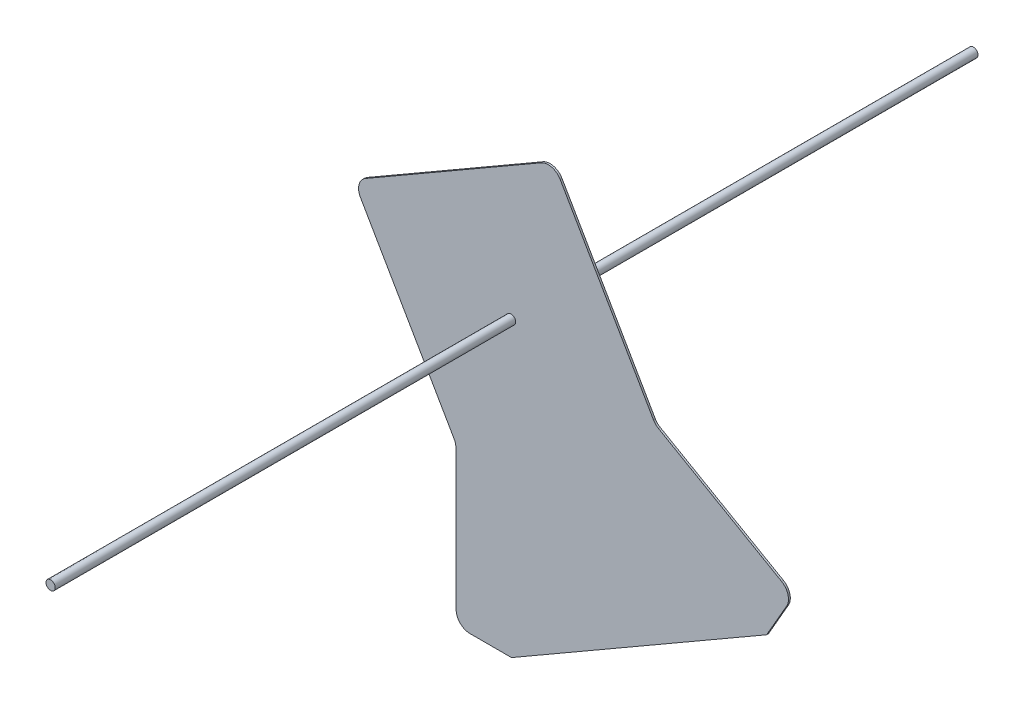
ISO-10303-21;
HEADER;
FILE_DESCRIPTION(('STEP AP214'),'2;1');
FILE_NAME('part.step','',(''),(''),'','','');
FILE_SCHEMA(('AUTOMOTIVE_DESIGN { 1 0 10303 214 1 1 1 1 }'));
ENDSEC;
DATA;
#1=APPLICATION_CONTEXT('core data for automotive mechanical design processes');
#2=APPLICATION_PROTOCOL_DEFINITION('international standard','automotive_design',2000,#1);
#3=PRODUCT_CONTEXT('',#1,'mechanical');
#4=PRODUCT('Part','Part','',(#3));
#5=PRODUCT_RELATED_PRODUCT_CATEGORY('part','',(#4));
#6=PRODUCT_DEFINITION_FORMATION('','',#4);
#7=PRODUCT_DEFINITION_CONTEXT('part definition',#1,'design');
#8=PRODUCT_DEFINITION('design','',#6,#7);
#9=PRODUCT_DEFINITION_SHAPE('','',#8);
#10=(LENGTH_UNIT() NAMED_UNIT(*) SI_UNIT(.MILLI.,.METRE.));
#11=(NAMED_UNIT(*) PLANE_ANGLE_UNIT() SI_UNIT($,.RADIAN.));
#12=(NAMED_UNIT(*) SI_UNIT($,.STERADIAN.) SOLID_ANGLE_UNIT());
#13=UNCERTAINTY_MEASURE_WITH_UNIT(LENGTH_MEASURE(1.E-05),#10,'distance_accuracy_value','');
#14=(GEOMETRIC_REPRESENTATION_CONTEXT(3) GLOBAL_UNCERTAINTY_ASSIGNED_CONTEXT((#13)) GLOBAL_UNIT_ASSIGNED_CONTEXT((#10,
#11,#12)) REPRESENTATION_CONTEXT('',''));
#15=CARTESIAN_POINT('',(0.,0.,0.));
#16=DIRECTION('',(0.,0.,1.));
#17=DIRECTION('',(1.,0.,0.));
#18=AXIS2_PLACEMENT_3D('',#15,#16,#17);
#19=CARTESIAN_POINT('',(-224.997652469632,389.707365661133,2.));
#20=DIRECTION('',(-0.499999999999995,0.866025403784442,0.));
#21=DIRECTION('',(-0.866025403784442,-0.499999999999995,0.));
#22=AXIS2_PLACEMENT_3D('',#19,#20,#21);
#23=PLANE('',#22);
#24=DIRECTION('',(0.866025403784442,0.499999999999995,0.));
#25=VECTOR('',#24,1.);
#26=CARTESIAN_POINT('',(-224.997652469632,389.707365661133,-2.));
#27=LINE('',#26,#25);
#28=CARTESIAN_POINT('',(-501.679240656574,229.965176241591,-2.));
#29=VERTEX_POINT('',#28);
#30=CARTESIAN_POINT('',(51.0988965922598,549.111782584341,-2.));
#31=VERTEX_POINT('',#30);
#32=EDGE_CURVE('E160',#29,#31,#27,.T.);
#33=ORIENTED_EDGE('',*,*,#32,.T.);
#34=DIRECTION('',(0.,0.,-1.));
#35=VECTOR('',#34,1.);
#36=CARTESIAN_POINT('',(51.0988965922598,549.111782584341,2.));
#37=LINE('',#36,#35);
#38=CARTESIAN_POINT('',(51.0988965922598,549.111782584341,2.));
#39=VERTEX_POINT('',#38);
#40=EDGE_CURVE('E142',#39,#31,#37,.T.);
#41=ORIENTED_EDGE('',*,*,#40,.F.);
#42=DIRECTION('',(0.866025403784442,0.499999999999995,0.));
#43=VECTOR('',#42,1.);
#44=CARTESIAN_POINT('',(-224.997652469632,389.707365661133,2.));
#45=LINE('',#44,#43);
#46=CARTESIAN_POINT('',(-501.679240656574,229.965176241591,2.));
#47=VERTEX_POINT('',#46);
#48=EDGE_CURVE('E148',#47,#39,#45,.T.);
#49=ORIENTED_EDGE('',*,*,#48,.F.);
#50=DIRECTION('',(0.,0.,-1.));
#51=VECTOR('',#50,1.);
#52=CARTESIAN_POINT('',(-501.679240656574,229.965176241591,2.));
#53=LINE('',#52,#51);
#54=EDGE_CURVE('E162',#47,#29,#53,.T.);
#55=ORIENTED_EDGE('',*,*,#54,.T.);
#56=EDGE_LOOP('',(#33,#41,#49,#55));
#57=FACE_BOUND('',#56,.T.);
#58=ADVANCED_FACE('F35',(#57),#23,.F.);
#59=CARTESIAN_POINT('',(-198.958680551287,114.462756420913,2.));
#60=DIRECTION('',(-0.866790469900428,0.498672519084214,0.));
#61=DIRECTION('',(-0.498672519084214,-0.866790469900428,0.));
#62=AXIS2_PLACEMENT_3D('',#59,#60,#61);
#63=PLANE('',#62);
#64=DIRECTION('',(0.498672519084214,0.866790469900428,0.));
#65=VECTOR('',#64,1.);
#66=CARTESIAN_POINT('',(-198.958680551287,114.462756420913,-2.));
#67=LINE('',#66,#65);
#68=CARTESIAN_POINT('',(94.5961274560885,624.718485855388,-2.));
#69=VERTEX_POINT('',#68);
#70=EDGE_CURVE('E250',#31,#69,#67,.T.);
#71=ORIENTED_EDGE('',*,*,#70,.T.);
#72=DIRECTION('',(0.,0.,-1.));
#73=VECTOR('',#72,1.);
#74=CARTESIAN_POINT('',(94.5961274560885,624.718485855388,2.));
#75=LINE('',#74,#73);
#76=CARTESIAN_POINT('',(94.5961274560885,624.718485855388,2.));
#77=VERTEX_POINT('',#76);
#78=EDGE_CURVE('E145',#69,#77,#75,.F.);
#79=ORIENTED_EDGE('',*,*,#78,.T.);
#80=DIRECTION('',(0.498672519084214,0.866790469900428,0.));
#81=VECTOR('',#80,1.);
#82=CARTESIAN_POINT('',(-198.958680551287,114.462756420913,2.));
#83=LINE('',#82,#81);
#84=EDGE_CURVE('E137',#39,#77,#83,.T.);
#85=ORIENTED_EDGE('',*,*,#84,.F.);
#86=ORIENTED_EDGE('',*,*,#40,.T.);
#87=EDGE_LOOP('',(#71,#79,#85,#86));
#88=FACE_BOUND('',#87,.T.);
#89=ADVANCED_FACE('F140',(#88),#63,.F.);
#90=CARTESIAN_POINT('',(308.514983579901,536.259443531488,2.));
#91=DIRECTION('',(-0.498672519084214,-0.866790469900428,0.));
#92=DIRECTION('',(0.866790469900428,-0.498672519084214,0.));
#93=AXIS2_PLACEMENT_3D('',#90,#91,#92);
#94=PLANE('',#93);
#95=DIRECTION('',(-0.866790469900428,0.498672519084214,0.));
#96=VECTOR('',#95,1.);
#97=CARTESIAN_POINT('',(308.514983579901,536.259443531488,-2.));
#98=LINE('',#97,#96);
#99=CARTESIAN_POINT('',(83.5525889316021,665.682375524927,-2.));
#100=VERTEX_POINT('',#99);
#101=CARTESIAN_POINT('',(-183.096289978038,819.087924817741,-2.));
#102=VERTEX_POINT('',#101);
#103=EDGE_CURVE('E253',#100,#102,#98,.T.);
#104=ORIENTED_EDGE('',*,*,#103,.T.);
#105=DIRECTION('',(0.,0.,-1.));
#106=VECTOR('',#105,1.);
#107=CARTESIAN_POINT('',(-183.096289978038,819.087924817741,2.));
#108=LINE('',#107,#106);
#109=CARTESIAN_POINT('',(-183.096289978038,819.087924817741,2.));
#110=VERTEX_POINT('',#109);
#111=EDGE_CURVE('E177',#102,#110,#108,.F.);
#112=ORIENTED_EDGE('',*,*,#111,.T.);
#113=DIRECTION('',(-0.866790469900428,0.498672519084214,0.));
#114=VECTOR('',#113,1.);
#115=CARTESIAN_POINT('',(308.514983579901,536.259443531488,2.));
#116=LINE('',#115,#114);
#117=CARTESIAN_POINT('',(83.5525889316021,665.682375524927,2.));
#118=VERTEX_POINT('',#117);
#119=EDGE_CURVE('E147',#118,#110,#116,.T.);
#120=ORIENTED_EDGE('',*,*,#119,.F.);
#121=DIRECTION('',(0.,0.,-1.));
#122=VECTOR('',#121,1.);
#123=CARTESIAN_POINT('',(83.5525889316021,665.682375524927,2.));
#124=LINE('',#123,#122);
#125=EDGE_CURVE('E174',#118,#100,#124,.T.);
#126=ORIENTED_EDGE('',*,*,#125,.T.);
#127=EDGE_LOOP('',(#104,#112,#120,#126));
#128=FACE_BOUND('',#127,.T.);
#129=ADVANCED_FACE('F285',(#128),#94,.F.);
#130=CARTESIAN_POINT('',(213.852565995331,123.467836544295,2.));
#131=DIRECTION('',(0.866025403784441,0.499999999999995,0.));
#132=DIRECTION('',(-0.499999999999995,0.866025403784442,0.));
#133=AXIS2_PLACEMENT_3D('',#130,#131,#132);
#134=PLANE('',#133);
#135=DIRECTION('',(0.499999999999995,-0.866025403784442,0.));
#136=VECTOR('',#135,1.);
#137=CARTESIAN_POINT('',(213.852565995331,123.467836544295,2.));
#138=LINE('',#137,#136);
#139=CARTESIAN_POINT('',(-396.145086474297,1180.01476311945,2.));
#140=VERTEX_POINT('',#139);
#141=CARTESIAN_POINT('',(-194.116876519045,830.091638914754,2.));
#142=VERTEX_POINT('',#141);
#143=EDGE_CURVE('E303',#140,#142,#138,.T.);
#144=ORIENTED_EDGE('',*,*,#143,.T.);
#145=DIRECTION('',(0.,0.,-1.));
#146=VECTOR('',#145,1.);
#147=CARTESIAN_POINT('',(-194.116876519045,830.091638914754,2.));
#148=LINE('',#147,#146);
#149=CARTESIAN_POINT('',(-194.116876519045,830.091638914754,-2.));
#150=VERTEX_POINT('',#149);
#151=EDGE_CURVE('E171',#142,#150,#148,.T.);
#152=ORIENTED_EDGE('',*,*,#151,.T.);
#153=DIRECTION('',(0.499999999999995,-0.866025403784442,0.));
#154=VECTOR('',#153,1.);
#155=CARTESIAN_POINT('',(213.852565995331,123.467836544295,-2.));
#156=LINE('',#155,#154);
#157=CARTESIAN_POINT('',(-396.145086474297,1180.01476311945,-2.));
#158=VERTEX_POINT('',#157);
#159=EDGE_CURVE('E256',#158,#150,#156,.T.);
#160=ORIENTED_EDGE('',*,*,#159,.F.);
#161=DIRECTION('',(0.,0.,-1.));
#162=VECTOR('',#161,1.);
#163=CARTESIAN_POINT('',(-396.145086474297,1180.01476311945,2.));
#164=LINE('',#163,#162);
#165=EDGE_CURVE('E165',#158,#140,#164,.F.);
#166=ORIENTED_EDGE('',*,*,#165,.T.);
#167=EDGE_LOOP('',(#144,#152,#160,#166));
#168=FACE_BOUND('',#167,.T.);
#169=ADVANCED_FACE('F306',(#168),#134,.T.);
#170=CARTESIAN_POINT('',(-624.997652469628,1082.52768868869,2.));
#171=DIRECTION('',(-0.499999999999995,0.866025403784442,0.));
#172=DIRECTION('',(-0.866025403784442,-0.499999999999995,0.));
#173=AXIS2_PLACEMENT_3D('',#170,#171,#172);
#174=PLANE('',#173);
#175=DIRECTION('',(0.866025403784442,0.499999999999995,0.));
#176=VECTOR('',#175,1.);
#177=CARTESIAN_POINT('',(-624.997652469628,1082.52768868869,2.));
#178=LINE('',#177,#176);
#179=CARTESIAN_POINT('',(-818.177026252984,970.995525232984,2.));
#180=VERTEX_POINT('',#179);
#181=CARTESIAN_POINT('',(-437.12584858783,1190.99552523298,2.));
#182=VERTEX_POINT('',#181);
#183=EDGE_CURVE('E245',#180,#182,#178,.T.);
#184=ORIENTED_EDGE('',*,*,#183,.T.);
#185=DIRECTION('',(0.,0.,-1.));
#186=VECTOR('',#185,1.);
#187=CARTESIAN_POINT('',(-437.12584858783,1190.99552523298,2.));
#188=LINE('',#187,#186);
#189=CARTESIAN_POINT('',(-437.12584858783,1190.99552523298,-2.));
#190=VERTEX_POINT('',#189);
#191=EDGE_CURVE('E209',#182,#190,#188,.T.);
#192=ORIENTED_EDGE('',*,*,#191,.T.);
#193=DIRECTION('',(0.866025403784442,0.499999999999995,0.));
#194=VECTOR('',#193,1.);
#195=CARTESIAN_POINT('',(-624.997652469628,1082.52768868869,-2.));
#196=LINE('',#195,#194);
#197=CARTESIAN_POINT('',(-818.177026252984,970.995525232984,-2.));
#198=VERTEX_POINT('',#197);
#199=EDGE_CURVE('E232',#198,#190,#196,.T.);
#200=ORIENTED_EDGE('',*,*,#199,.F.);
#201=DIRECTION('',(0.,0.,-1.));
#202=VECTOR('',#201,1.);
#203=CARTESIAN_POINT('',(-818.177026252984,970.995525232984,2.));
#204=LINE('',#203,#202);
#205=EDGE_CURVE('E57',#198,#180,#204,.F.);
#206=ORIENTED_EDGE('',*,*,#205,.T.);
#207=EDGE_LOOP('',(#184,#192,#200,#206));
#208=FACE_BOUND('',#207,.T.);
#209=ADVANCED_FACE('F345',(#208),#174,.T.);
#210=CARTESIAN_POINT('',(-219.160135896889,-126.532163455702,2.));
#211=DIRECTION('',(0.866025403784441,0.499999999999995,0.));
#212=DIRECTION('',(-0.499999999999995,0.866025403784442,0.));
#213=AXIS2_PLACEMENT_3D('',#210,#211,#212);
#214=PLANE('',#213);
#215=DIRECTION('',(0.499999999999995,-0.866025403784441,0.));
#216=VECTOR('',#215,1.);
#217=CARTESIAN_POINT('',(-219.160135896889,-126.532163455702,-2.));
#218=LINE('',#217,#216);
#219=CARTESIAN_POINT('',(-829.157788366518,930.014763119451,-2.));
#220=VERTEX_POINT('',#219);
#221=CARTESIAN_POINT('',(-626.209683122657,578.498333537244,-2.));
#222=VERTEX_POINT('',#221);
#223=EDGE_CURVE('E221',#220,#222,#218,.T.);
#224=ORIENTED_EDGE('',*,*,#223,.T.);
#225=DIRECTION('',(0.,0.,-1.));
#226=VECTOR('',#225,1.);
#227=CARTESIAN_POINT('',(-626.209683122657,578.498333537244,2.));
#228=LINE('',#227,#226);
#229=CARTESIAN_POINT('',(-626.209683122657,578.498333537244,2.));
#230=VERTEX_POINT('',#229);
#231=EDGE_CURVE('E187',#222,#230,#228,.F.);
#232=ORIENTED_EDGE('',*,*,#231,.T.);
#233=DIRECTION('',(0.499999999999995,-0.866025403784441,0.));
#234=VECTOR('',#233,1.);
#235=CARTESIAN_POINT('',(-219.160135896889,-126.532163455702,2.));
#236=LINE('',#235,#234);
#237=CARTESIAN_POINT('',(-829.157788366518,930.014763119451,2.));
#238=VERTEX_POINT('',#237);
#239=EDGE_CURVE('E239',#238,#230,#236,.T.);
#240=ORIENTED_EDGE('',*,*,#239,.F.);
#241=DIRECTION('',(0.,0.,-1.));
#242=VECTOR('',#241,1.);
#243=CARTESIAN_POINT('',(-829.157788366518,930.014763119451,-2.));
#244=LINE('',#243,#242);
#245=EDGE_CURVE('E184',#238,#220,#244,.T.);
#246=ORIENTED_EDGE('',*,*,#245,.T.);
#247=EDGE_LOOP('',(#224,#232,#240,#246));
#248=FACE_BOUND('',#247,.T.);
#249=ADVANCED_FACE('F228',(#248),#214,.F.);
#250=CARTESIAN_POINT('',(-621.325577858295,-0.951974579278583,2.));
#251=DIRECTION('',(-0.999998826234128,-0.00153216525410841,0.));
#252=DIRECTION('',(0.00153216525410841,-0.999998826234128,0.));
#253=AXIS2_PLACEMENT_3D('',#250,#251,#252);
#254=PLANE('',#253);
#255=DIRECTION('',(-0.00153216525410841,0.999998826234128,0.));
#256=VECTOR('',#255,1.);
#257=CARTESIAN_POINT('',(-621.325577858295,-0.951974579278583,2.));
#258=LINE('',#257,#256);
#259=CARTESIAN_POINT('',(-621.725276094225,259.919211283968,2.));
#260=VERTEX_POINT('',#259);
#261=CARTESIAN_POINT('',(-622.190480449166,563.544298494868,2.));
#262=VERTEX_POINT('',#261);
#263=EDGE_CURVE('E237',#260,#262,#258,.T.);
#264=ORIENTED_EDGE('',*,*,#263,.T.);
#265=DIRECTION('',(0.,0.,-1.));
#266=VECTOR('',#265,1.);
#267=CARTESIAN_POINT('',(-622.190480449166,563.544298494868,2.));
#268=LINE('',#267,#266);
#269=CARTESIAN_POINT('',(-622.190480449166,563.544298494868,-2.));
#270=VERTEX_POINT('',#269);
#271=EDGE_CURVE('E181',#262,#270,#268,.T.);
#272=ORIENTED_EDGE('',*,*,#271,.T.);
#273=DIRECTION('',(-0.00153216525410841,0.999998826234128,0.));
#274=VECTOR('',#273,1.);
#275=CARTESIAN_POINT('',(-621.325577858295,-0.951974579278583,-2.));
#276=LINE('',#275,#274);
#277=CARTESIAN_POINT('',(-621.725276094225,259.919211283968,-2.));
#278=VERTEX_POINT('',#277);
#279=EDGE_CURVE('E223',#278,#270,#276,.T.);
#280=ORIENTED_EDGE('',*,*,#279,.F.);
#281=DIRECTION('',(0.,0.,-1.));
#282=VECTOR('',#281,1.);
#283=CARTESIAN_POINT('',(-621.725276094225,259.919211283968,2.));
#284=LINE('',#283,#282);
#285=EDGE_CURVE('E179',#278,#260,#284,.F.);
#286=ORIENTED_EDGE('',*,*,#285,.T.);
#287=EDGE_LOOP('',(#264,#272,#280,#286));
#288=FACE_BOUND('',#287,.T.);
#289=ADVANCED_FACE('F241',(#288),#254,.T.);
#290=CARTESIAN_POINT('',(0.,229.965176241591,2.));
#291=DIRECTION('',(0.,-1.,0.));
#292=DIRECTION('',(0.,0.,-1.));
#293=AXIS2_PLACEMENT_3D('',#290,#291,#292);
#294=PLANE('',#293);
#295=DIRECTION('',(-1.,0.,0.));
#296=VECTOR('',#295,1.);
#297=CARTESIAN_POINT('',(0.,229.965176241591,2.));
#298=LINE('',#297,#296);
#299=CARTESIAN_POINT('',(-591.725311307201,229.965176241591,2.));
#300=VERTEX_POINT('',#299);
#301=EDGE_CURVE('E155',#47,#300,#298,.T.);
#302=ORIENTED_EDGE('',*,*,#301,.T.);
#303=DIRECTION('',(0.,0.,-1.));
#304=VECTOR('',#303,1.);
#305=CARTESIAN_POINT('',(-591.725311307201,229.965176241591,2.));
#306=LINE('',#305,#304);
#307=CARTESIAN_POINT('',(-591.725311307201,229.965176241591,-2.));
#308=VERTEX_POINT('',#307);
#309=EDGE_CURVE('E189',#300,#308,#306,.T.);
#310=ORIENTED_EDGE('',*,*,#309,.T.);
#311=DIRECTION('',(-1.,0.,0.));
#312=VECTOR('',#311,1.);
#313=CARTESIAN_POINT('',(0.,229.965176241591,-2.));
#314=LINE('',#313,#312);
#315=EDGE_CURVE('E157',#29,#308,#314,.T.);
#316=ORIENTED_EDGE('',*,*,#315,.F.);
#317=ORIENTED_EDGE('',*,*,#54,.F.);
#318=EDGE_LOOP('',(#302,#310,#316,#317));
#319=FACE_BOUND('',#318,.T.);
#320=ADVANCED_FACE('F263',(#319),#294,.T.);
#321=CARTESIAN_POINT('',(0.,0.,2.));
#322=DIRECTION('',(0.,0.,1.));
#323=DIRECTION('',(1.,0.,0.));
#324=AXIS2_PLACEMENT_3D('',#321,#322,#323);
#325=PLANE('',#324);
#326=CARTESIAN_POINT('',(-502.651437420408,864.489174286872,2.));
#327=DIRECTION('',(0.,0.,1.));
#328=DIRECTION('',(1.,0.,0.));
#329=AXIS2_PLACEMENT_3D('',#326,#327,#328);
#330=CIRCLE('',#329,9.99999999999998);
#331=CARTESIAN_POINT('',(-492.651437420408,864.489174286872,2.));
#332=VERTEX_POINT('',#331);
#333=EDGE_CURVE('E251',#332,#332,#330,.F.);
#334=ORIENTED_EDGE('',*,*,#333,.T.);
#335=EDGE_LOOP('',(#334));
#336=FACE_BOUND('',#335,.T.);
#337=ORIENTED_EDGE('',*,*,#263,.F.);
#338=CARTESIAN_POINT('',(-591.725311307201,259.965176241591,2.));
#339=DIRECTION('',(0.,0.,1.));
#340=DIRECTION('',(1.,0.,0.));
#341=AXIS2_PLACEMENT_3D('',#338,#339,#340);
#342=CIRCLE('',#341,30.);
#343=EDGE_CURVE('E205',#260,#300,#342,.T.);
#344=ORIENTED_EDGE('',*,*,#343,.T.);
#345=ORIENTED_EDGE('',*,*,#301,.F.);
#346=ORIENTED_EDGE('',*,*,#48,.T.);
#347=ORIENTED_EDGE('',*,*,#84,.T.);
#348=CARTESIAN_POINT('',(68.5924133590757,639.678661427914,2.));
#349=DIRECTION('',(0.,0.,1.));
#350=DIRECTION('',(1.,0.,0.));
#351=AXIS2_PLACEMENT_3D('',#348,#349,#350);
#352=CIRCLE('',#351,30.);
#353=EDGE_CURVE('E203',#77,#118,#352,.T.);
#354=ORIENTED_EDGE('',*,*,#353,.T.);
#355=ORIENTED_EDGE('',*,*,#119,.T.);
#356=CARTESIAN_POINT('',(-168.136114405511,845.091638914754,2.));
#357=DIRECTION('',(0.,0.,1.));
#358=DIRECTION('',(1.,0.,0.));
#359=AXIS2_PLACEMENT_3D('',#356,#357,#358);
#360=CIRCLE('',#359,30.);
#361=EDGE_CURVE('E214',#110,#142,#360,.F.);
#362=ORIENTED_EDGE('',*,*,#361,.T.);
#363=ORIENTED_EDGE('',*,*,#143,.F.);
#364=CARTESIAN_POINT('',(-422.12584858783,1165.01476311945,2.));
#365=DIRECTION('',(0.,0.,1.));
#366=DIRECTION('',(1.,0.,0.));
#367=AXIS2_PLACEMENT_3D('',#364,#365,#366);
#368=CIRCLE('',#367,30.);
#369=EDGE_CURVE('E50',#140,#182,#368,.T.);
#370=ORIENTED_EDGE('',*,*,#369,.T.);
#371=ORIENTED_EDGE('',*,*,#183,.F.);
#372=CARTESIAN_POINT('',(-803.177026252984,945.014763119451,2.));
#373=DIRECTION('',(0.,0.,1.));
#374=DIRECTION('',(1.,0.,0.));
#375=AXIS2_PLACEMENT_3D('',#372,#373,#374);
#376=CIRCLE('',#375,30.);
#377=EDGE_CURVE('E200',#180,#238,#376,.T.);
#378=ORIENTED_EDGE('',*,*,#377,.T.);
#379=ORIENTED_EDGE('',*,*,#239,.T.);
#380=CARTESIAN_POINT('',(-652.19044523619,563.498333537244,2.));
#381=DIRECTION('',(0.,0.,1.));
#382=DIRECTION('',(1.,0.,0.));
#383=AXIS2_PLACEMENT_3D('',#380,#381,#382);
#384=CIRCLE('',#383,30.);
#385=EDGE_CURVE('E11',#230,#262,#384,.F.);
#386=ORIENTED_EDGE('',*,*,#385,.T.);
#387=EDGE_LOOP('',(#337,#344,#345,#346,#347,#354,#355,#362,#363,#370,#371,#378,#379,#386));
#388=FACE_BOUND('',#387,.T.);
#389=ADVANCED_FACE('F153',(#336,#388),#325,.T.);
#390=CARTESIAN_POINT('',(0.,0.,-2.));
#391=DIRECTION('',(0.,0.,1.));
#392=DIRECTION('',(1.,0.,0.));
#393=AXIS2_PLACEMENT_3D('',#390,#391,#392);
#394=PLANE('',#393);
#395=CARTESIAN_POINT('',(-502.651437420408,864.489174286872,-2.));
#396=DIRECTION('',(0.,0.,1.));
#397=DIRECTION('',(1.,0.,0.));
#398=AXIS2_PLACEMENT_3D('',#395,#396,#397);
#399=CIRCLE('',#398,9.99999999999998);
#400=CARTESIAN_POINT('',(-492.651437420408,864.489174286872,-2.));
#401=VERTEX_POINT('',#400);
#402=EDGE_CURVE('E161',#401,#401,#399,.F.);
#403=ORIENTED_EDGE('',*,*,#402,.F.);
#404=EDGE_LOOP('',(#403));
#405=FACE_BOUND('',#404,.T.);
#406=ORIENTED_EDGE('',*,*,#315,.T.);
#407=CARTESIAN_POINT('',(-591.725311307201,259.965176241591,-2.));
#408=DIRECTION('',(0.,0.,1.));
#409=DIRECTION('',(1.,0.,0.));
#410=AXIS2_PLACEMENT_3D('',#407,#408,#409);
#411=CIRCLE('',#410,30.);
#412=EDGE_CURVE('E198',#308,#278,#411,.F.);
#413=ORIENTED_EDGE('',*,*,#412,.T.);
#414=ORIENTED_EDGE('',*,*,#279,.T.);
#415=CARTESIAN_POINT('',(-652.19044523619,563.498333537244,-2.));
#416=DIRECTION('',(0.,0.,1.));
#417=DIRECTION('',(1.,0.,0.));
#418=AXIS2_PLACEMENT_3D('',#415,#416,#417);
#419=CIRCLE('',#418,30.);
#420=EDGE_CURVE('E43',#270,#222,#419,.T.);
#421=ORIENTED_EDGE('',*,*,#420,.T.);
#422=ORIENTED_EDGE('',*,*,#223,.F.);
#423=CARTESIAN_POINT('',(-803.177026252984,945.014763119451,-2.));
#424=DIRECTION('',(0.,0.,1.));
#425=DIRECTION('',(1.,0.,0.));
#426=AXIS2_PLACEMENT_3D('',#423,#424,#425);
#427=CIRCLE('',#426,30.);
#428=EDGE_CURVE('E192',#220,#198,#427,.F.);
#429=ORIENTED_EDGE('',*,*,#428,.T.);
#430=ORIENTED_EDGE('',*,*,#199,.T.);
#431=CARTESIAN_POINT('',(-422.12584858783,1165.01476311945,-2.));
#432=DIRECTION('',(0.,0.,1.));
#433=DIRECTION('',(1.,0.,0.));
#434=AXIS2_PLACEMENT_3D('',#431,#432,#433);
#435=CIRCLE('',#434,30.);
#436=EDGE_CURVE('E194',#190,#158,#435,.F.);
#437=ORIENTED_EDGE('',*,*,#436,.T.);
#438=ORIENTED_EDGE('',*,*,#159,.T.);
#439=CARTESIAN_POINT('',(-168.136114405511,845.091638914754,-2.));
#440=DIRECTION('',(0.,0.,1.));
#441=DIRECTION('',(1.,0.,0.));
#442=AXIS2_PLACEMENT_3D('',#439,#440,#441);
#443=CIRCLE('',#442,30.);
#444=EDGE_CURVE('E212',#150,#102,#443,.T.);
#445=ORIENTED_EDGE('',*,*,#444,.T.);
#446=ORIENTED_EDGE('',*,*,#103,.F.);
#447=CARTESIAN_POINT('',(68.5924133590757,639.678661427914,-2.));
#448=DIRECTION('',(0.,0.,1.));
#449=DIRECTION('',(1.,0.,0.));
#450=AXIS2_PLACEMENT_3D('',#447,#448,#449);
#451=CIRCLE('',#450,30.);
#452=EDGE_CURVE('E196',#100,#69,#451,.F.);
#453=ORIENTED_EDGE('',*,*,#452,.T.);
#454=ORIENTED_EDGE('',*,*,#70,.F.);
#455=ORIENTED_EDGE('',*,*,#32,.F.);
#456=EDGE_LOOP('',(#406,#413,#414,#421,#422,#429,#430,#437,#438,#445,#446,#453,#454,#455));
#457=FACE_BOUND('',#456,.T.);
#458=ADVANCED_FACE('F220',(#405,#457),#394,.F.);
#459=CARTESIAN_POINT('',(0.,0.,-1000.));
#460=DIRECTION('',(0.,0.,1.));
#461=DIRECTION('',(1.,0.,0.));
#462=AXIS2_PLACEMENT_3D('',#459,#460,#461);
#463=PLANE('',#462);
#464=CARTESIAN_POINT('',(-502.651437420408,864.489174286872,-1000.));
#465=DIRECTION('',(0.,0.,1.));
#466=DIRECTION('',(1.,0.,0.));
#467=AXIS2_PLACEMENT_3D('',#464,#465,#466);
#468=CIRCLE('',#467,9.99999999999998);
#469=CARTESIAN_POINT('',(-492.651437420408,864.489174286872,-1000.));
#470=VERTEX_POINT('',#469);
#471=EDGE_CURVE('E315',#470,#470,#468,.T.);
#472=ORIENTED_EDGE('',*,*,#471,.F.);
#473=EDGE_LOOP('',(#472));
#474=FACE_BOUND('',#473,.T.);
#475=ADVANCED_FACE('F328',(#474),#463,.F.);
#476=CARTESIAN_POINT('',(-502.651437420408,864.489174286872,1000.));
#477=DIRECTION('',(0.,0.,-1.));
#478=DIRECTION('',(-1.,0.,0.));
#479=AXIS2_PLACEMENT_3D('',#476,#477,#478);
#480=CYLINDRICAL_SURFACE('',#479,9.99999999999998);
#481=ORIENTED_EDGE('',*,*,#471,.T.);
#482=EDGE_LOOP('',(#481));
#483=FACE_BOUND('',#482,.T.);
#484=ORIENTED_EDGE('',*,*,#402,.T.);
#485=EDGE_LOOP('',(#484));
#486=FACE_BOUND('',#485,.T.);
#487=ADVANCED_FACE('F322',(#483,#486),#480,.T.);
#488=ORIENTED_EDGE('',*,*,#333,.F.);
#489=EDGE_LOOP('',(#488));
#490=FACE_BOUND('',#489,.T.);
#491=CARTESIAN_POINT('',(-502.651437420408,864.489174286872,1000.));
#492=DIRECTION('',(0.,0.,1.));
#493=DIRECTION('',(1.,0.,0.));
#494=AXIS2_PLACEMENT_3D('',#491,#492,#493);
#495=CIRCLE('',#494,9.99999999999998);
#496=CARTESIAN_POINT('',(-492.651437420408,864.489174286872,1000.));
#497=VERTEX_POINT('',#496);
#498=EDGE_CURVE('E314',#497,#497,#495,.T.);
#499=ORIENTED_EDGE('',*,*,#498,.F.);
#500=EDGE_LOOP('',(#499));
#501=FACE_BOUND('',#500,.T.);
#502=ADVANCED_FACE('F295',(#490,#501),#480,.T.);
#503=CARTESIAN_POINT('',(0.,0.,1000.));
#504=DIRECTION('',(0.,0.,1.));
#505=DIRECTION('',(1.,0.,0.));
#506=AXIS2_PLACEMENT_3D('',#503,#504,#505);
#507=PLANE('',#506);
#508=ORIENTED_EDGE('',*,*,#498,.T.);
#509=EDGE_LOOP('',(#508));
#510=FACE_BOUND('',#509,.T.);
#511=ADVANCED_FACE('F290',(#510),#507,.T.);
#512=CARTESIAN_POINT('',(-168.136114405511,845.091638914754,2.));
#513=DIRECTION('',(0.,0.,-1.));
#514=DIRECTION('',(-1.,0.,0.));
#515=AXIS2_PLACEMENT_3D('',#512,#513,#514);
#516=CYLINDRICAL_SURFACE('',#515,30.);
#517=ORIENTED_EDGE('',*,*,#361,.F.);
#518=ORIENTED_EDGE('',*,*,#111,.F.);
#519=ORIENTED_EDGE('',*,*,#444,.F.);
#520=ORIENTED_EDGE('',*,*,#151,.F.);
#521=EDGE_LOOP('',(#517,#518,#519,#520));
#522=FACE_BOUND('',#521,.T.);
#523=ADVANCED_FACE('F277',(#522),#516,.F.);
#524=CARTESIAN_POINT('',(-652.19044523619,563.498333537244,2.));
#525=DIRECTION('',(0.,0.,-1.));
#526=DIRECTION('',(-1.,0.,0.));
#527=AXIS2_PLACEMENT_3D('',#524,#525,#526);
#528=CYLINDRICAL_SURFACE('',#527,30.);
#529=ORIENTED_EDGE('',*,*,#385,.F.);
#530=ORIENTED_EDGE('',*,*,#231,.F.);
#531=ORIENTED_EDGE('',*,*,#420,.F.);
#532=ORIENTED_EDGE('',*,*,#271,.F.);
#533=EDGE_LOOP('',(#529,#530,#531,#532));
#534=FACE_BOUND('',#533,.T.);
#535=ADVANCED_FACE('F235',(#534),#528,.F.);
#536=CARTESIAN_POINT('',(-591.725311307201,259.965176241591,2.));
#537=DIRECTION('',(0.,0.,-1.));
#538=DIRECTION('',(-1.,0.,0.));
#539=AXIS2_PLACEMENT_3D('',#536,#537,#538);
#540=CYLINDRICAL_SURFACE('',#539,30.);
#541=ORIENTED_EDGE('',*,*,#343,.F.);
#542=ORIENTED_EDGE('',*,*,#285,.F.);
#543=ORIENTED_EDGE('',*,*,#412,.F.);
#544=ORIENTED_EDGE('',*,*,#309,.F.);
#545=EDGE_LOOP('',(#541,#542,#543,#544));
#546=FACE_BOUND('',#545,.T.);
#547=ADVANCED_FACE('F266',(#546),#540,.T.);
#548=CARTESIAN_POINT('',(68.5924133590757,639.678661427914,2.));
#549=DIRECTION('',(0.,0.,-1.));
#550=DIRECTION('',(-1.,0.,0.));
#551=AXIS2_PLACEMENT_3D('',#548,#549,#550);
#552=CYLINDRICAL_SURFACE('',#551,30.);
#553=ORIENTED_EDGE('',*,*,#353,.F.);
#554=ORIENTED_EDGE('',*,*,#78,.F.);
#555=ORIENTED_EDGE('',*,*,#452,.F.);
#556=ORIENTED_EDGE('',*,*,#125,.F.);
#557=EDGE_LOOP('',(#553,#554,#555,#556));
#558=FACE_BOUND('',#557,.T.);
#559=ADVANCED_FACE('F268',(#558),#552,.T.);
#560=CARTESIAN_POINT('',(-422.12584858783,1165.01476311945,2.));
#561=DIRECTION('',(0.,0.,-1.));
#562=DIRECTION('',(-1.,0.,0.));
#563=AXIS2_PLACEMENT_3D('',#560,#561,#562);
#564=CYLINDRICAL_SURFACE('',#563,30.);
#565=ORIENTED_EDGE('',*,*,#369,.F.);
#566=ORIENTED_EDGE('',*,*,#165,.F.);
#567=ORIENTED_EDGE('',*,*,#436,.F.);
#568=ORIENTED_EDGE('',*,*,#191,.F.);
#569=EDGE_LOOP('',(#565,#566,#567,#568));
#570=FACE_BOUND('',#569,.T.);
#571=ADVANCED_FACE('F274',(#570),#564,.T.);
#572=CARTESIAN_POINT('',(-803.177026252984,945.014763119451,2.));
#573=DIRECTION('',(0.,0.,1.));
#574=DIRECTION('',(1.,0.,0.));
#575=AXIS2_PLACEMENT_3D('',#572,#573,#574);
#576=CYLINDRICAL_SURFACE('',#575,30.);
#577=ORIENTED_EDGE('',*,*,#377,.F.);
#578=ORIENTED_EDGE('',*,*,#205,.F.);
#579=ORIENTED_EDGE('',*,*,#428,.F.);
#580=ORIENTED_EDGE('',*,*,#245,.F.);
#581=EDGE_LOOP('',(#577,#578,#579,#580));
#582=FACE_BOUND('',#581,.T.);
#583=ADVANCED_FACE('F37',(#582),#576,.T.);
#584=CLOSED_SHELL('',(#58,#89,#129,#169,#209,#249,#289,#320,#389,#458,#475,#487,#502,#511,#523,
#535,#547,#559,#571,#583));
#585=MANIFOLD_SOLID_BREP('B2',#584);
#586=ADVANCED_BREP_SHAPE_REPRESENTATION('',(#18,#585),#14);
#587=SHAPE_DEFINITION_REPRESENTATION(#9,#586);
ENDSEC;
END-ISO-10303-21;
